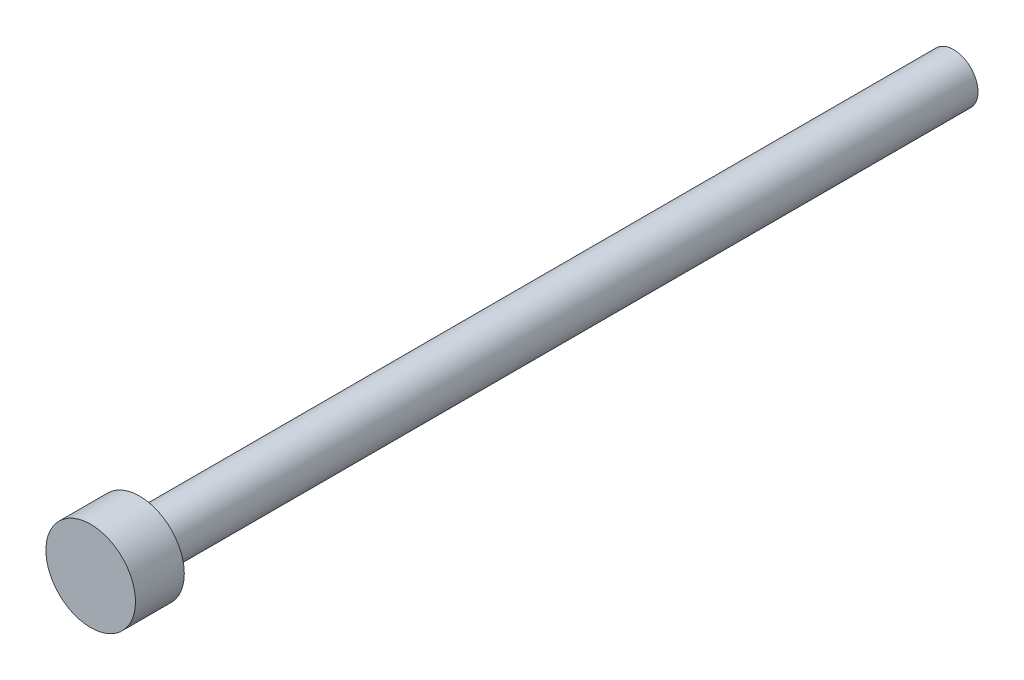
ISO-10303-21;
HEADER;
FILE_DESCRIPTION(('STEP AP214'),'2;1');
FILE_NAME('part.step','',(''),(''),'','','');
FILE_SCHEMA(('AUTOMOTIVE_DESIGN { 1 0 10303 214 1 1 1 1 }'));
ENDSEC;
DATA;
#1=APPLICATION_CONTEXT('core data for automotive mechanical design processes');
#2=APPLICATION_PROTOCOL_DEFINITION('international standard','automotive_design',2000,#1);
#3=PRODUCT_CONTEXT('',#1,'mechanical');
#4=PRODUCT('Part','Part','',(#3));
#5=PRODUCT_RELATED_PRODUCT_CATEGORY('part','',(#4));
#6=PRODUCT_DEFINITION_FORMATION('','',#4);
#7=PRODUCT_DEFINITION_CONTEXT('part definition',#1,'design');
#8=PRODUCT_DEFINITION('design','',#6,#7);
#9=PRODUCT_DEFINITION_SHAPE('','',#8);
#10=(LENGTH_UNIT() NAMED_UNIT(*) SI_UNIT(.MILLI.,.METRE.));
#11=(NAMED_UNIT(*) PLANE_ANGLE_UNIT() SI_UNIT($,.RADIAN.));
#12=(NAMED_UNIT(*) SI_UNIT($,.STERADIAN.) SOLID_ANGLE_UNIT());
#13=UNCERTAINTY_MEASURE_WITH_UNIT(LENGTH_MEASURE(1.E-05),#10,'distance_accuracy_value','');
#14=(GEOMETRIC_REPRESENTATION_CONTEXT(3) GLOBAL_UNCERTAINTY_ASSIGNED_CONTEXT((#13)) GLOBAL_UNIT_ASSIGNED_CONTEXT((#10,
#11,#12)) REPRESENTATION_CONTEXT('',''));
#15=CARTESIAN_POINT('',(0.,0.,0.));
#16=DIRECTION('',(0.,0.,1.));
#17=DIRECTION('',(1.,0.,0.));
#18=AXIS2_PLACEMENT_3D('',#15,#16,#17);
#19=CARTESIAN_POINT('',(0.,0.,0.));
#20=DIRECTION('',(0.,0.,-1.));
#21=DIRECTION('',(-1.,0.,0.));
#22=AXIS2_PLACEMENT_3D('',#19,#20,#21);
#23=CYLINDRICAL_SURFACE('',#22,1.5);
#24=CARTESIAN_POINT('',(0.,0.,0.));
#25=DIRECTION('',(0.,0.,1.));
#26=DIRECTION('',(1.,0.,0.));
#27=AXIS2_PLACEMENT_3D('',#24,#25,#26);
#28=CIRCLE('',#27,1.5);
#29=CARTESIAN_POINT('',(1.5,0.,0.));
#30=VERTEX_POINT('',#29);
#31=EDGE_CURVE('E10',#30,#30,#28,.T.);
#32=ORIENTED_EDGE('',*,*,#31,.F.);
#33=EDGE_LOOP('',(#32));
#34=FACE_BOUND('',#33,.T.);
#35=CARTESIAN_POINT('',(0.,0.,-50.));
#36=DIRECTION('',(0.,0.,1.));
#37=DIRECTION('',(1.,0.,0.));
#38=AXIS2_PLACEMENT_3D('',#35,#36,#37);
#39=CIRCLE('',#38,1.5);
#40=CARTESIAN_POINT('',(1.5,0.,-50.));
#41=VERTEX_POINT('',#40);
#42=EDGE_CURVE('E37',#41,#41,#39,.T.);
#43=ORIENTED_EDGE('',*,*,#42,.T.);
#44=EDGE_LOOP('',(#43));
#45=FACE_BOUND('',#44,.T.);
#46=ADVANCED_FACE('F40',(#34,#45),#23,.T.);
#47=CARTESIAN_POINT('',(0.,0.,-50.));
#48=DIRECTION('',(0.,0.,1.));
#49=DIRECTION('',(1.,0.,0.));
#50=AXIS2_PLACEMENT_3D('',#47,#48,#49);
#51=PLANE('',#50);
#52=ORIENTED_EDGE('',*,*,#42,.F.);
#53=EDGE_LOOP('',(#52));
#54=FACE_BOUND('',#53,.T.);
#55=ADVANCED_FACE('F58',(#54),#51,.F.);
#56=CARTESIAN_POINT('',(0.,0.,3.));
#57=DIRECTION('',(0.,0.,-1.));
#58=DIRECTION('',(-1.,0.,0.));
#59=AXIS2_PLACEMENT_3D('',#56,#57,#58);
#60=CYLINDRICAL_SURFACE('',#59,2.75);
#61=CARTESIAN_POINT('',(0.,0.,3.));
#62=DIRECTION('',(0.,0.,1.));
#63=DIRECTION('',(1.,0.,0.));
#64=AXIS2_PLACEMENT_3D('',#61,#62,#63);
#65=CIRCLE('',#64,2.75);
#66=CARTESIAN_POINT('',(2.75,0.,3.));
#67=VERTEX_POINT('',#66);
#68=EDGE_CURVE('E50',#67,#67,#65,.T.);
#69=ORIENTED_EDGE('',*,*,#68,.F.);
#70=EDGE_LOOP('',(#69));
#71=FACE_BOUND('',#70,.T.);
#72=CARTESIAN_POINT('',(0.,0.,0.));
#73=DIRECTION('',(0.,0.,1.));
#74=DIRECTION('',(1.,0.,0.));
#75=AXIS2_PLACEMENT_3D('',#72,#73,#74);
#76=CIRCLE('',#75,2.75);
#77=CARTESIAN_POINT('',(2.75,0.,0.));
#78=VERTEX_POINT('',#77);
#79=EDGE_CURVE('E47',#78,#78,#76,.T.);
#80=ORIENTED_EDGE('',*,*,#79,.T.);
#81=EDGE_LOOP('',(#80));
#82=FACE_BOUND('',#81,.T.);
#83=ADVANCED_FACE('F60',(#71,#82),#60,.T.);
#84=CARTESIAN_POINT('',(0.,0.,3.));
#85=DIRECTION('',(0.,0.,1.));
#86=DIRECTION('',(1.,0.,0.));
#87=AXIS2_PLACEMENT_3D('',#84,#85,#86);
#88=PLANE('',#87);
#89=ORIENTED_EDGE('',*,*,#68,.T.);
#90=EDGE_LOOP('',(#89));
#91=FACE_BOUND('',#90,.T.);
#92=ADVANCED_FACE('F54',(#91),#88,.T.);
#93=CARTESIAN_POINT('',(0.,0.,0.));
#94=DIRECTION('',(0.,0.,1.));
#95=DIRECTION('',(1.,0.,0.));
#96=AXIS2_PLACEMENT_3D('',#93,#94,#95);
#97=PLANE('',#96);
#98=ORIENTED_EDGE('',*,*,#31,.T.);
#99=EDGE_LOOP('',(#98));
#100=FACE_BOUND('',#99,.T.);
#101=ORIENTED_EDGE('',*,*,#79,.F.);
#102=EDGE_LOOP('',(#101));
#103=FACE_BOUND('',#102,.T.);
#104=ADVANCED_FACE('F63',(#100,#103),#97,.F.);
#105=CLOSED_SHELL('',(#46,#55,#83,#92,#104));
#106=MANIFOLD_SOLID_BREP('B2',#105);
#107=ADVANCED_BREP_SHAPE_REPRESENTATION('',(#18,#106),#14);
#108=SHAPE_DEFINITION_REPRESENTATION(#9,#107);
ENDSEC;
END-ISO-10303-21;
